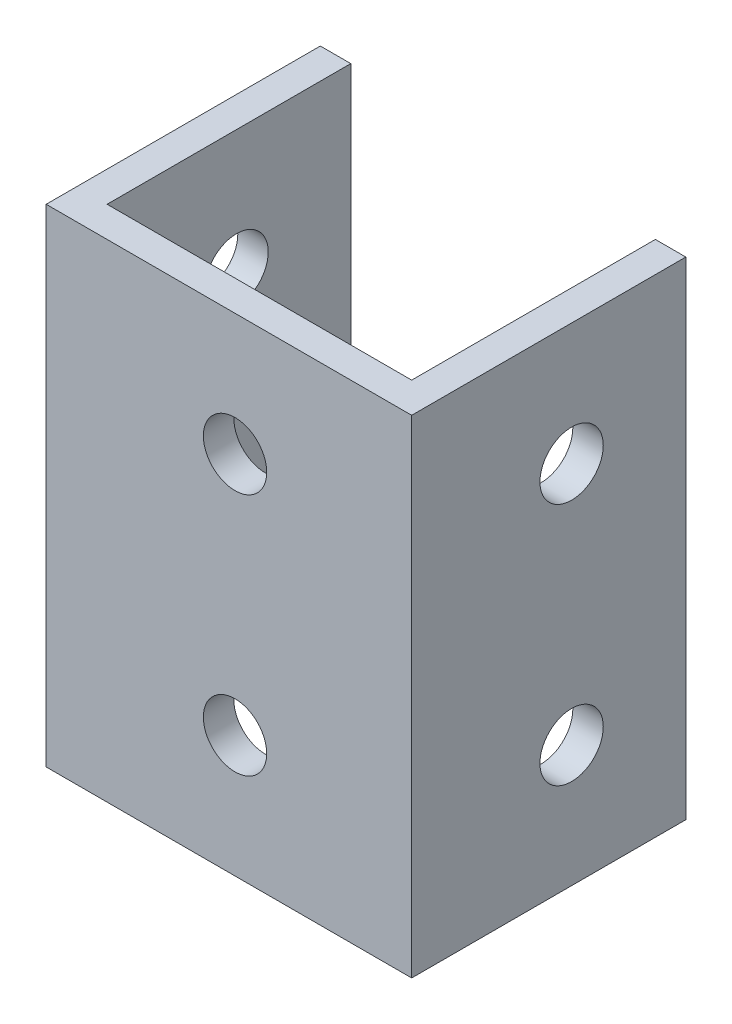
ISO-10303-21;
HEADER;
FILE_DESCRIPTION(('STEP AP214'),'2;1');
FILE_NAME('part.step','',(''),(''),'','','');
FILE_SCHEMA(('AUTOMOTIVE_DESIGN { 1 0 10303 214 1 1 1 1 }'));
ENDSEC;
DATA;
#1=APPLICATION_CONTEXT('core data for automotive mechanical design processes');
#2=APPLICATION_PROTOCOL_DEFINITION('international standard','automotive_design',2000,#1);
#3=PRODUCT_CONTEXT('',#1,'mechanical');
#4=PRODUCT('Part','Part','',(#3));
#5=PRODUCT_RELATED_PRODUCT_CATEGORY('part','',(#4));
#6=PRODUCT_DEFINITION_FORMATION('','',#4);
#7=PRODUCT_DEFINITION_CONTEXT('part definition',#1,'design');
#8=PRODUCT_DEFINITION('design','',#6,#7);
#9=PRODUCT_DEFINITION_SHAPE('','',#8);
#10=(LENGTH_UNIT() NAMED_UNIT(*) SI_UNIT(.MILLI.,.METRE.));
#11=(NAMED_UNIT(*) PLANE_ANGLE_UNIT() SI_UNIT($,.RADIAN.));
#12=(NAMED_UNIT(*) SI_UNIT($,.STERADIAN.) SOLID_ANGLE_UNIT());
#13=UNCERTAINTY_MEASURE_WITH_UNIT(LENGTH_MEASURE(1.E-05),#10,'distance_accuracy_value','');
#14=(GEOMETRIC_REPRESENTATION_CONTEXT(3) GLOBAL_UNCERTAINTY_ASSIGNED_CONTEXT((#13)) GLOBAL_UNIT_ASSIGNED_CONTEXT((#10,
#11,#12)) REPRESENTATION_CONTEXT('',''));
#15=CARTESIAN_POINT('',(0.,0.,0.));
#16=DIRECTION('',(0.,0.,1.));
#17=DIRECTION('',(1.,0.,0.));
#18=AXIS2_PLACEMENT_3D('',#15,#16,#17);
#19=CARTESIAN_POINT('',(3.175,50.8,0.));
#20=DIRECTION('',(0.,0.,1.));
#21=DIRECTION('',(1.,0.,0.));
#22=AXIS2_PLACEMENT_3D('',#19,#20,#21);
#23=PLANE('',#22);
#24=DIRECTION('',(-1.,0.,0.));
#25=VECTOR('',#24,1.);
#26=CARTESIAN_POINT('',(3.175,0.,0.));
#27=LINE('',#26,#25);
#28=CARTESIAN_POINT('',(3.175,0.,0.));
#29=VERTEX_POINT('',#28);
#30=CARTESIAN_POINT('',(0.,0.,0.));
#31=VERTEX_POINT('',#30);
#32=EDGE_CURVE('E133',#29,#31,#27,.T.);
#33=ORIENTED_EDGE('',*,*,#32,.T.);
#34=DIRECTION('',(0.,-1.,0.));
#35=VECTOR('',#34,1.);
#36=CARTESIAN_POINT('',(0.,50.8,0.));
#37=LINE('',#36,#35);
#38=CARTESIAN_POINT('',(0.,50.8,0.));
#39=VERTEX_POINT('',#38);
#40=EDGE_CURVE('E11',#39,#31,#37,.T.);
#41=ORIENTED_EDGE('',*,*,#40,.F.);
#42=DIRECTION('',(-1.,0.,0.));
#43=VECTOR('',#42,1.);
#44=CARTESIAN_POINT('',(3.175,50.8,0.));
#45=LINE('',#44,#43);
#46=CARTESIAN_POINT('',(3.175,50.8,0.));
#47=VERTEX_POINT('',#46);
#48=EDGE_CURVE('E148',#47,#39,#45,.T.);
#49=ORIENTED_EDGE('',*,*,#48,.F.);
#50=DIRECTION('',(0.,-1.,0.));
#51=VECTOR('',#50,1.);
#52=CARTESIAN_POINT('',(3.175,50.8,0.));
#53=LINE('',#52,#51);
#54=EDGE_CURVE('E129',#47,#29,#53,.T.);
#55=ORIENTED_EDGE('',*,*,#54,.T.);
#56=EDGE_LOOP('',(#33,#41,#49,#55));
#57=FACE_BOUND('',#56,.T.);
#58=ADVANCED_FACE('F35',(#57),#23,.F.);
#59=CARTESIAN_POINT('',(0.,50.8,0.));
#60=DIRECTION('',(1.,0.,0.));
#61=DIRECTION('',(0.,0.,-1.));
#62=AXIS2_PLACEMENT_3D('',#59,#60,#61);
#63=PLANE('',#62);
#64=CARTESIAN_POINT('',(0.,12.7,11.90625));
#65=DIRECTION('',(1.,0.,0.));
#66=DIRECTION('',(0.,0.,-1.));
#67=AXIS2_PLACEMENT_3D('',#64,#65,#66);
#68=CIRCLE('',#67,3.302);
#69=CARTESIAN_POINT('',(0.,12.7,8.60425));
#70=VERTEX_POINT('',#69);
#71=EDGE_CURVE('E321',#70,#70,#68,.T.);
#72=ORIENTED_EDGE('',*,*,#71,.T.);
#73=EDGE_LOOP('',(#72));
#74=FACE_BOUND('',#73,.T.);
#75=CARTESIAN_POINT('',(0.,38.1,11.90625));
#76=DIRECTION('',(1.,0.,0.));
#77=DIRECTION('',(0.,0.,-1.));
#78=AXIS2_PLACEMENT_3D('',#75,#76,#77);
#79=CIRCLE('',#78,3.302);
#80=CARTESIAN_POINT('',(0.,38.1,8.60425));
#81=VERTEX_POINT('',#80);
#82=EDGE_CURVE('E162',#81,#81,#79,.T.);
#83=ORIENTED_EDGE('',*,*,#82,.T.);
#84=EDGE_LOOP('',(#83));
#85=FACE_BOUND('',#84,.T.);
#86=DIRECTION('',(0.,0.,1.));
#87=VECTOR('',#86,1.);
#88=CARTESIAN_POINT('',(0.,0.,0.));
#89=LINE('',#88,#87);
#90=CARTESIAN_POINT('',(0.,0.,28.575));
#91=VERTEX_POINT('',#90);
#92=EDGE_CURVE('E136',#31,#91,#89,.T.);
#93=ORIENTED_EDGE('',*,*,#92,.T.);
#94=DIRECTION('',(0.,-1.,0.));
#95=VECTOR('',#94,1.);
#96=CARTESIAN_POINT('',(0.,50.8,28.575));
#97=LINE('',#96,#95);
#98=CARTESIAN_POINT('',(0.,50.8,28.575));
#99=VERTEX_POINT('',#98);
#100=EDGE_CURVE('E44',#99,#91,#97,.T.);
#101=ORIENTED_EDGE('',*,*,#100,.F.);
#102=DIRECTION('',(0.,0.,1.));
#103=VECTOR('',#102,1.);
#104=CARTESIAN_POINT('',(0.,50.8,0.));
#105=LINE('',#104,#103);
#106=EDGE_CURVE('E96',#39,#99,#105,.T.);
#107=ORIENTED_EDGE('',*,*,#106,.F.);
#108=ORIENTED_EDGE('',*,*,#40,.T.);
#109=EDGE_LOOP('',(#93,#101,#107,#108));
#110=FACE_BOUND('',#109,.T.);
#111=ADVANCED_FACE('F225',(#74,#85,#110),#63,.F.);
#112=CARTESIAN_POINT('',(0.,50.8,28.575));
#113=DIRECTION('',(0.,0.,-1.));
#114=DIRECTION('',(-1.,0.,0.));
#115=AXIS2_PLACEMENT_3D('',#112,#113,#114);
#116=PLANE('',#115);
#117=CARTESIAN_POINT('',(19.685,38.0911070321901,28.575));
#118=DIRECTION('',(0.,0.,-1.));
#119=DIRECTION('',(-1.,0.,0.));
#120=AXIS2_PLACEMENT_3D('',#117,#118,#119);
#121=CIRCLE('',#120,3.302);
#122=CARTESIAN_POINT('',(16.383,38.0911070321901,28.575));
#123=VERTEX_POINT('',#122);
#124=EDGE_CURVE('E181',#123,#123,#121,.T.);
#125=ORIENTED_EDGE('',*,*,#124,.T.);
#126=EDGE_LOOP('',(#125));
#127=FACE_BOUND('',#126,.T.);
#128=CARTESIAN_POINT('',(19.685,12.7,28.575));
#129=DIRECTION('',(0.,0.,-1.));
#130=DIRECTION('',(-1.,0.,0.));
#131=AXIS2_PLACEMENT_3D('',#128,#129,#130);
#132=CIRCLE('',#131,3.302);
#133=CARTESIAN_POINT('',(16.383,12.7,28.575));
#134=VERTEX_POINT('',#133);
#135=EDGE_CURVE('E137',#134,#134,#132,.T.);
#136=ORIENTED_EDGE('',*,*,#135,.T.);
#137=EDGE_LOOP('',(#136));
#138=FACE_BOUND('',#137,.T.);
#139=DIRECTION('',(1.,0.,0.));
#140=VECTOR('',#139,1.);
#141=CARTESIAN_POINT('',(0.,0.,28.575));
#142=LINE('',#141,#140);
#143=CARTESIAN_POINT('',(38.1,0.,28.575));
#144=VERTEX_POINT('',#143);
#145=EDGE_CURVE('E139',#91,#144,#142,.T.);
#146=ORIENTED_EDGE('',*,*,#145,.T.);
#147=DIRECTION('',(0.,-1.,0.));
#148=VECTOR('',#147,1.);
#149=CARTESIAN_POINT('',(38.1,50.8,28.575));
#150=LINE('',#149,#148);
#151=CARTESIAN_POINT('',(38.1,50.8,28.575));
#152=VERTEX_POINT('',#151);
#153=EDGE_CURVE('E155',#152,#144,#150,.T.);
#154=ORIENTED_EDGE('',*,*,#153,.F.);
#155=DIRECTION('',(1.,0.,0.));
#156=VECTOR('',#155,1.);
#157=CARTESIAN_POINT('',(0.,50.8,28.575));
#158=LINE('',#157,#156);
#159=EDGE_CURVE('E191',#99,#152,#158,.T.);
#160=ORIENTED_EDGE('',*,*,#159,.F.);
#161=ORIENTED_EDGE('',*,*,#100,.T.);
#162=EDGE_LOOP('',(#146,#154,#160,#161));
#163=FACE_BOUND('',#162,.T.);
#164=ADVANCED_FACE('F229',(#127,#138,#163),#116,.F.);
#165=CARTESIAN_POINT('',(38.1,50.8,28.575));
#166=DIRECTION('',(-1.,0.,0.));
#167=DIRECTION('',(0.,0.,1.));
#168=AXIS2_PLACEMENT_3D('',#165,#166,#167);
#169=PLANE('',#168);
#170=CARTESIAN_POINT('',(38.1,12.7,11.90625));
#171=DIRECTION('',(1.,0.,0.));
#172=DIRECTION('',(0.,0.,-1.));
#173=AXIS2_PLACEMENT_3D('',#170,#171,#172);
#174=CIRCLE('',#173,3.302);
#175=CARTESIAN_POINT('',(38.1,12.7,8.60425));
#176=VERTEX_POINT('',#175);
#177=EDGE_CURVE('E320',#176,#176,#174,.T.);
#178=ORIENTED_EDGE('',*,*,#177,.F.);
#179=EDGE_LOOP('',(#178));
#180=FACE_BOUND('',#179,.T.);
#181=CARTESIAN_POINT('',(38.1,38.1,11.90625));
#182=DIRECTION('',(1.,0.,0.));
#183=DIRECTION('',(0.,0.,-1.));
#184=AXIS2_PLACEMENT_3D('',#181,#182,#183);
#185=CIRCLE('',#184,3.302);
#186=CARTESIAN_POINT('',(38.1,38.1,8.60425));
#187=VERTEX_POINT('',#186);
#188=EDGE_CURVE('E169',#187,#187,#185,.T.);
#189=ORIENTED_EDGE('',*,*,#188,.F.);
#190=EDGE_LOOP('',(#189));
#191=FACE_BOUND('',#190,.T.);
#192=DIRECTION('',(0.,0.,-1.));
#193=VECTOR('',#192,1.);
#194=CARTESIAN_POINT('',(38.1,0.,28.575));
#195=LINE('',#194,#193);
#196=CARTESIAN_POINT('',(38.1,0.,0.));
#197=VERTEX_POINT('',#196);
#198=EDGE_CURVE('E141',#144,#197,#195,.T.);
#199=ORIENTED_EDGE('',*,*,#198,.T.);
#200=DIRECTION('',(0.,-1.,0.));
#201=VECTOR('',#200,1.);
#202=CARTESIAN_POINT('',(38.1,50.8,0.));
#203=LINE('',#202,#201);
#204=CARTESIAN_POINT('',(38.1,50.8,0.));
#205=VERTEX_POINT('',#204);
#206=EDGE_CURVE('E152',#205,#197,#203,.T.);
#207=ORIENTED_EDGE('',*,*,#206,.F.);
#208=DIRECTION('',(0.,0.,-1.));
#209=VECTOR('',#208,1.);
#210=CARTESIAN_POINT('',(38.1,50.8,28.575));
#211=LINE('',#210,#209);
#212=EDGE_CURVE('E193',#152,#205,#211,.T.);
#213=ORIENTED_EDGE('',*,*,#212,.F.);
#214=ORIENTED_EDGE('',*,*,#153,.T.);
#215=EDGE_LOOP('',(#199,#207,#213,#214));
#216=FACE_BOUND('',#215,.T.);
#217=ADVANCED_FACE('F199',(#180,#191,#216),#169,.F.);
#218=CARTESIAN_POINT('',(38.1,50.8,0.));
#219=DIRECTION('',(0.,0.,1.));
#220=DIRECTION('',(1.,0.,0.));
#221=AXIS2_PLACEMENT_3D('',#218,#219,#220);
#222=PLANE('',#221);
#223=DIRECTION('',(-1.,0.,0.));
#224=VECTOR('',#223,1.);
#225=CARTESIAN_POINT('',(38.1,0.,0.));
#226=LINE('',#225,#224);
#227=CARTESIAN_POINT('',(34.925,0.,0.));
#228=VERTEX_POINT('',#227);
#229=EDGE_CURVE('E143',#197,#228,#226,.T.);
#230=ORIENTED_EDGE('',*,*,#229,.T.);
#231=DIRECTION('',(0.,-1.,0.));
#232=VECTOR('',#231,1.);
#233=CARTESIAN_POINT('',(34.925,50.8,0.));
#234=LINE('',#233,#232);
#235=CARTESIAN_POINT('',(34.925,50.8,0.));
#236=VERTEX_POINT('',#235);
#237=EDGE_CURVE('E124',#236,#228,#234,.T.);
#238=ORIENTED_EDGE('',*,*,#237,.F.);
#239=DIRECTION('',(-1.,0.,0.));
#240=VECTOR('',#239,1.);
#241=CARTESIAN_POINT('',(38.1,50.8,0.));
#242=LINE('',#241,#240);
#243=EDGE_CURVE('E115',#205,#236,#242,.T.);
#244=ORIENTED_EDGE('',*,*,#243,.F.);
#245=ORIENTED_EDGE('',*,*,#206,.T.);
#246=EDGE_LOOP('',(#230,#238,#244,#245));
#247=FACE_BOUND('',#246,.T.);
#248=ADVANCED_FACE('F203',(#247),#222,.F.);
#249=CARTESIAN_POINT('',(34.925,50.8,0.));
#250=DIRECTION('',(1.,0.,0.));
#251=DIRECTION('',(0.,0.,-1.));
#252=AXIS2_PLACEMENT_3D('',#249,#250,#251);
#253=PLANE('',#252);
#254=CARTESIAN_POINT('',(34.925,12.7,11.90625));
#255=DIRECTION('',(1.,0.,0.));
#256=DIRECTION('',(0.,0.,-1.));
#257=AXIS2_PLACEMENT_3D('',#254,#255,#256);
#258=CIRCLE('',#257,3.302);
#259=CARTESIAN_POINT('',(34.925,12.7,8.60425));
#260=VERTEX_POINT('',#259);
#261=EDGE_CURVE('E174',#260,#260,#258,.T.);
#262=ORIENTED_EDGE('',*,*,#261,.T.);
#263=EDGE_LOOP('',(#262));
#264=FACE_BOUND('',#263,.T.);
#265=CARTESIAN_POINT('',(34.925,38.1,11.90625));
#266=DIRECTION('',(1.,0.,0.));
#267=DIRECTION('',(0.,0.,-1.));
#268=AXIS2_PLACEMENT_3D('',#265,#266,#267);
#269=CIRCLE('',#268,3.302);
#270=CARTESIAN_POINT('',(34.925,38.1,8.60425));
#271=VERTEX_POINT('',#270);
#272=EDGE_CURVE('E161',#271,#271,#269,.T.);
#273=ORIENTED_EDGE('',*,*,#272,.T.);
#274=EDGE_LOOP('',(#273));
#275=FACE_BOUND('',#274,.T.);
#276=DIRECTION('',(0.,0.,1.));
#277=VECTOR('',#276,1.);
#278=CARTESIAN_POINT('',(34.925,0.,0.));
#279=LINE('',#278,#277);
#280=CARTESIAN_POINT('',(34.925,0.,25.4));
#281=VERTEX_POINT('',#280);
#282=EDGE_CURVE('E123',#228,#281,#279,.T.);
#283=ORIENTED_EDGE('',*,*,#282,.T.);
#284=DIRECTION('',(0.,-1.,0.));
#285=VECTOR('',#284,1.);
#286=CARTESIAN_POINT('',(34.925,50.8,25.4));
#287=LINE('',#286,#285);
#288=CARTESIAN_POINT('',(34.925,50.8,25.4));
#289=VERTEX_POINT('',#288);
#290=EDGE_CURVE('E120',#289,#281,#287,.T.);
#291=ORIENTED_EDGE('',*,*,#290,.F.);
#292=DIRECTION('',(0.,0.,1.));
#293=VECTOR('',#292,1.);
#294=CARTESIAN_POINT('',(34.925,50.8,0.));
#295=LINE('',#294,#293);
#296=EDGE_CURVE('E109',#236,#289,#295,.T.);
#297=ORIENTED_EDGE('',*,*,#296,.F.);
#298=ORIENTED_EDGE('',*,*,#237,.T.);
#299=EDGE_LOOP('',(#283,#291,#297,#298));
#300=FACE_BOUND('',#299,.T.);
#301=ADVANCED_FACE('F121',(#264,#275,#300),#253,.F.);
#302=CARTESIAN_POINT('',(34.925,50.8,25.4));
#303=DIRECTION('',(0.,0.,1.));
#304=DIRECTION('',(1.,0.,0.));
#305=AXIS2_PLACEMENT_3D('',#302,#303,#304);
#306=PLANE('',#305);
#307=CARTESIAN_POINT('',(19.685,38.0911070321901,25.4));
#308=DIRECTION('',(0.,0.,-1.));
#309=DIRECTION('',(-1.,0.,0.));
#310=AXIS2_PLACEMENT_3D('',#307,#308,#309);
#311=CIRCLE('',#310,3.302);
#312=CARTESIAN_POINT('',(16.383,38.0911070321901,25.4));
#313=VERTEX_POINT('',#312);
#314=EDGE_CURVE('E166',#313,#313,#311,.T.);
#315=ORIENTED_EDGE('',*,*,#314,.F.);
#316=EDGE_LOOP('',(#315));
#317=FACE_BOUND('',#316,.T.);
#318=CARTESIAN_POINT('',(19.685,12.7,25.4));
#319=DIRECTION('',(0.,0.,-1.));
#320=DIRECTION('',(-1.,0.,0.));
#321=AXIS2_PLACEMENT_3D('',#318,#319,#320);
#322=CIRCLE('',#321,3.302);
#323=CARTESIAN_POINT('',(16.383,12.7,25.4));
#324=VERTEX_POINT('',#323);
#325=EDGE_CURVE('E184',#324,#324,#322,.T.);
#326=ORIENTED_EDGE('',*,*,#325,.F.);
#327=EDGE_LOOP('',(#326));
#328=FACE_BOUND('',#327,.T.);
#329=DIRECTION('',(-1.,0.,0.));
#330=VECTOR('',#329,1.);
#331=CARTESIAN_POINT('',(34.925,0.,25.4));
#332=LINE('',#331,#330);
#333=CARTESIAN_POINT('',(3.175,0.,25.4));
#334=VERTEX_POINT('',#333);
#335=EDGE_CURVE('E82',#281,#334,#332,.T.);
#336=ORIENTED_EDGE('',*,*,#335,.T.);
#337=DIRECTION('',(0.,-1.,0.));
#338=VECTOR('',#337,1.);
#339=CARTESIAN_POINT('',(3.175,50.8,25.4));
#340=LINE('',#339,#338);
#341=CARTESIAN_POINT('',(3.175,50.8,25.4));
#342=VERTEX_POINT('',#341);
#343=EDGE_CURVE('E125',#342,#334,#340,.T.);
#344=ORIENTED_EDGE('',*,*,#343,.F.);
#345=DIRECTION('',(-1.,0.,0.));
#346=VECTOR('',#345,1.);
#347=CARTESIAN_POINT('',(34.925,50.8,25.4));
#348=LINE('',#347,#346);
#349=EDGE_CURVE('E113',#289,#342,#348,.T.);
#350=ORIENTED_EDGE('',*,*,#349,.F.);
#351=ORIENTED_EDGE('',*,*,#290,.T.);
#352=EDGE_LOOP('',(#336,#344,#350,#351));
#353=FACE_BOUND('',#352,.T.);
#354=ADVANCED_FACE('F127',(#317,#328,#353),#306,.F.);
#355=CARTESIAN_POINT('',(3.175,50.8,25.4));
#356=DIRECTION('',(-1.,0.,0.));
#357=DIRECTION('',(0.,0.,1.));
#358=AXIS2_PLACEMENT_3D('',#355,#356,#357);
#359=PLANE('',#358);
#360=CARTESIAN_POINT('',(3.175,12.7,11.90625));
#361=DIRECTION('',(-1.,0.,0.));
#362=DIRECTION('',(0.,0.,1.));
#363=AXIS2_PLACEMENT_3D('',#360,#361,#362);
#364=CIRCLE('',#363,3.302);
#365=CARTESIAN_POINT('',(3.175,12.7,15.20825));
#366=VERTEX_POINT('',#365);
#367=EDGE_CURVE('E38',#366,#366,#364,.T.);
#368=ORIENTED_EDGE('',*,*,#367,.T.);
#369=EDGE_LOOP('',(#368));
#370=FACE_BOUND('',#369,.T.);
#371=CARTESIAN_POINT('',(3.175,38.1,11.90625));
#372=DIRECTION('',(-1.,0.,0.));
#373=DIRECTION('',(0.,0.,1.));
#374=AXIS2_PLACEMENT_3D('',#371,#372,#373);
#375=CIRCLE('',#374,3.302);
#376=CARTESIAN_POINT('',(3.175,38.1,15.20825));
#377=VERTEX_POINT('',#376);
#378=EDGE_CURVE('E159',#377,#377,#375,.T.);
#379=ORIENTED_EDGE('',*,*,#378,.T.);
#380=EDGE_LOOP('',(#379));
#381=FACE_BOUND('',#380,.T.);
#382=DIRECTION('',(0.,0.,-1.));
#383=VECTOR('',#382,1.);
#384=CARTESIAN_POINT('',(3.175,0.,25.4));
#385=LINE('',#384,#383);
#386=EDGE_CURVE('E88',#334,#29,#385,.T.);
#387=ORIENTED_EDGE('',*,*,#386,.T.);
#388=ORIENTED_EDGE('',*,*,#54,.F.);
#389=DIRECTION('',(0.,0.,-1.));
#390=VECTOR('',#389,1.);
#391=CARTESIAN_POINT('',(3.175,50.8,25.4));
#392=LINE('',#391,#390);
#393=EDGE_CURVE('E53',#342,#47,#392,.T.);
#394=ORIENTED_EDGE('',*,*,#393,.F.);
#395=ORIENTED_EDGE('',*,*,#343,.T.);
#396=EDGE_LOOP('',(#387,#388,#394,#395));
#397=FACE_BOUND('',#396,.T.);
#398=ADVANCED_FACE('F211',(#370,#381,#397),#359,.F.);
#399=CARTESIAN_POINT('',(0.,50.8,0.));
#400=DIRECTION('',(0.,1.,0.));
#401=DIRECTION('',(0.,0.,1.));
#402=AXIS2_PLACEMENT_3D('',#399,#400,#401);
#403=PLANE('',#402);
#404=ORIENTED_EDGE('',*,*,#48,.T.);
#405=ORIENTED_EDGE('',*,*,#106,.T.);
#406=ORIENTED_EDGE('',*,*,#159,.T.);
#407=ORIENTED_EDGE('',*,*,#212,.T.);
#408=ORIENTED_EDGE('',*,*,#243,.T.);
#409=ORIENTED_EDGE('',*,*,#296,.T.);
#410=ORIENTED_EDGE('',*,*,#349,.T.);
#411=ORIENTED_EDGE('',*,*,#393,.T.);
#412=EDGE_LOOP('',(#404,#405,#406,#407,#408,#409,#410,#411));
#413=FACE_BOUND('',#412,.T.);
#414=ADVANCED_FACE('F111',(#413),#403,.T.);
#415=CARTESIAN_POINT('',(0.,0.,0.));
#416=DIRECTION('',(0.,1.,0.));
#417=DIRECTION('',(0.,0.,1.));
#418=AXIS2_PLACEMENT_3D('',#415,#416,#417);
#419=PLANE('',#418);
#420=ORIENTED_EDGE('',*,*,#32,.F.);
#421=ORIENTED_EDGE('',*,*,#386,.F.);
#422=ORIENTED_EDGE('',*,*,#335,.F.);
#423=ORIENTED_EDGE('',*,*,#282,.F.);
#424=ORIENTED_EDGE('',*,*,#229,.F.);
#425=ORIENTED_EDGE('',*,*,#198,.F.);
#426=ORIENTED_EDGE('',*,*,#145,.F.);
#427=ORIENTED_EDGE('',*,*,#92,.F.);
#428=EDGE_LOOP('',(#420,#421,#422,#423,#424,#425,#426,#427));
#429=FACE_BOUND('',#428,.T.);
#430=ADVANCED_FACE('F206',(#429),#419,.F.);
#431=CARTESIAN_POINT('',(19.685,12.7,76.2));
#432=DIRECTION('',(0.,0.,-1.));
#433=DIRECTION('',(-1.,0.,0.));
#434=AXIS2_PLACEMENT_3D('',#431,#432,#433);
#435=CYLINDRICAL_SURFACE('',#434,3.302);
#436=ORIENTED_EDGE('',*,*,#325,.T.);
#437=EDGE_LOOP('',(#436));
#438=FACE_BOUND('',#437,.T.);
#439=ORIENTED_EDGE('',*,*,#135,.F.);
#440=EDGE_LOOP('',(#439));
#441=FACE_BOUND('',#440,.T.);
#442=ADVANCED_FACE('F270',(#438,#441),#435,.F.);
#443=CARTESIAN_POINT('',(19.685,38.0911070321901,76.2));
#444=DIRECTION('',(0.,0.,-1.));
#445=DIRECTION('',(-1.,0.,0.));
#446=AXIS2_PLACEMENT_3D('',#443,#444,#445);
#447=CYLINDRICAL_SURFACE('',#446,3.302);
#448=ORIENTED_EDGE('',*,*,#314,.T.);
#449=EDGE_LOOP('',(#448));
#450=FACE_BOUND('',#449,.T.);
#451=ORIENTED_EDGE('',*,*,#124,.F.);
#452=EDGE_LOOP('',(#451));
#453=FACE_BOUND('',#452,.T.);
#454=ADVANCED_FACE('F265',(#450,#453),#447,.F.);
#455=CARTESIAN_POINT('',(0.,38.1,11.90625));
#456=DIRECTION('',(1.,0.,0.));
#457=DIRECTION('',(0.,0.,-1.));
#458=AXIS2_PLACEMENT_3D('',#455,#456,#457);
#459=CYLINDRICAL_SURFACE('',#458,3.302);
#460=ORIENTED_EDGE('',*,*,#82,.F.);
#461=EDGE_LOOP('',(#460));
#462=FACE_BOUND('',#461,.T.);
#463=ORIENTED_EDGE('',*,*,#378,.F.);
#464=EDGE_LOOP('',(#463));
#465=FACE_BOUND('',#464,.T.);
#466=ADVANCED_FACE('F255',(#462,#465),#459,.F.);
#467=ORIENTED_EDGE('',*,*,#188,.T.);
#468=EDGE_LOOP('',(#467));
#469=FACE_BOUND('',#468,.T.);
#470=ORIENTED_EDGE('',*,*,#272,.F.);
#471=EDGE_LOOP('',(#470));
#472=FACE_BOUND('',#471,.T.);
#473=ADVANCED_FACE('F252',(#469,#472),#459,.F.);
#474=CARTESIAN_POINT('',(0.,12.7,11.90625));
#475=DIRECTION('',(1.,0.,0.));
#476=DIRECTION('',(0.,0.,-1.));
#477=AXIS2_PLACEMENT_3D('',#474,#475,#476);
#478=CYLINDRICAL_SURFACE('',#477,3.302);
#479=ORIENTED_EDGE('',*,*,#71,.F.);
#480=EDGE_LOOP('',(#479));
#481=FACE_BOUND('',#480,.T.);
#482=ORIENTED_EDGE('',*,*,#367,.F.);
#483=EDGE_LOOP('',(#482));
#484=FACE_BOUND('',#483,.T.);
#485=ADVANCED_FACE('F254',(#481,#484),#478,.F.);
#486=ORIENTED_EDGE('',*,*,#177,.T.);
#487=EDGE_LOOP('',(#486));
#488=FACE_BOUND('',#487,.T.);
#489=ORIENTED_EDGE('',*,*,#261,.F.);
#490=EDGE_LOOP('',(#489));
#491=FACE_BOUND('',#490,.T.);
#492=ADVANCED_FACE('F262',(#488,#491),#478,.F.);
#493=CLOSED_SHELL('',(#58,#111,#164,#217,#248,#301,#354,#398,#414,#430,#442,#454,#466,#473,#485,#492));
#494=MANIFOLD_SOLID_BREP('B2',#493);
#495=ADVANCED_BREP_SHAPE_REPRESENTATION('',(#18,#494),#14);
#496=SHAPE_DEFINITION_REPRESENTATION(#9,#495);
ENDSEC;
END-ISO-10303-21;
